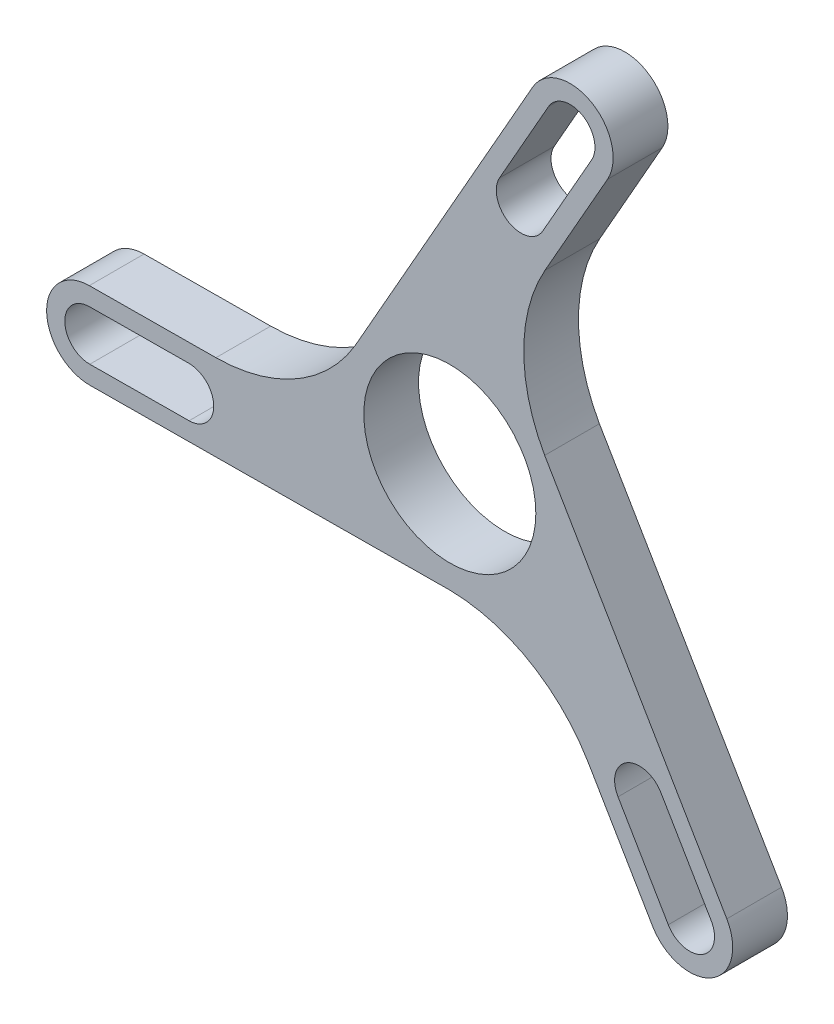
ISO-10303-21;
HEADER;
FILE_DESCRIPTION(('STEP AP214'),'2;1');
FILE_NAME('part.step','',(''),(''),'','','');
FILE_SCHEMA(('AUTOMOTIVE_DESIGN { 1 0 10303 214 1 1 1 1 }'));
ENDSEC;
DATA;
#1=APPLICATION_CONTEXT('core data for automotive mechanical design processes');
#2=APPLICATION_PROTOCOL_DEFINITION('international standard','automotive_design',2000,#1);
#3=PRODUCT_CONTEXT('',#1,'mechanical');
#4=PRODUCT('Part','Part','',(#3));
#5=PRODUCT_RELATED_PRODUCT_CATEGORY('part','',(#4));
#6=PRODUCT_DEFINITION_FORMATION('','',#4);
#7=PRODUCT_DEFINITION_CONTEXT('part definition',#1,'design');
#8=PRODUCT_DEFINITION('design','',#6,#7);
#9=PRODUCT_DEFINITION_SHAPE('','',#8);
#10=(LENGTH_UNIT() NAMED_UNIT(*) SI_UNIT(.MILLI.,.METRE.));
#11=(NAMED_UNIT(*) PLANE_ANGLE_UNIT() SI_UNIT($,.RADIAN.));
#12=(NAMED_UNIT(*) SI_UNIT($,.STERADIAN.) SOLID_ANGLE_UNIT());
#13=UNCERTAINTY_MEASURE_WITH_UNIT(LENGTH_MEASURE(1.E-05),#10,'distance_accuracy_value','');
#14=(GEOMETRIC_REPRESENTATION_CONTEXT(3) GLOBAL_UNCERTAINTY_ASSIGNED_CONTEXT((#13)) GLOBAL_UNIT_ASSIGNED_CONTEXT((#10,
#11,#12)) REPRESENTATION_CONTEXT('',''));
#15=CARTESIAN_POINT('',(0.,0.,0.));
#16=DIRECTION('',(0.,0.,1.));
#17=DIRECTION('',(1.,0.,0.));
#18=AXIS2_PLACEMENT_3D('',#15,#16,#17);
#19=CARTESIAN_POINT('',(-33.363139926865,-8.73696589252402,7.));
#20=DIRECTION('',(0.,0.,-1.));
#21=DIRECTION('',(-1.,0.,0.));
#22=AXIS2_PLACEMENT_3D('',#19,#20,#21);
#23=CYLINDRICAL_SURFACE('',#22,3.175);
#24=CARTESIAN_POINT('',(-33.363139926865,-8.73696589252402,0.));
#25=DIRECTION('',(0.,0.,1.));
#26=DIRECTION('',(1.,0.,0.));
#27=AXIS2_PLACEMENT_3D('',#24,#25,#26);
#28=CIRCLE('',#27,3.175);
#29=CARTESIAN_POINT('',(-33.340610024119,-11.9118859550582,0.));
#30=VERTEX_POINT('',#29);
#31=CARTESIAN_POINT('',(-33.3856698296109,-5.56204582998978,0.));
#32=VERTEX_POINT('',#31);
#33=EDGE_CURVE('E299',#30,#32,#28,.T.);
#34=ORIENTED_EDGE('',*,*,#33,.F.);
#35=DIRECTION('',(0.,0.,-1.));
#36=VECTOR('',#35,1.);
#37=CARTESIAN_POINT('',(-33.340610024119,-11.9118859550582,7.));
#38=LINE('',#37,#36);
#39=CARTESIAN_POINT('',(-33.340610024119,-11.9118859550582,7.));
#40=VERTEX_POINT('',#39);
#41=EDGE_CURVE('E11',#40,#30,#38,.T.);
#42=ORIENTED_EDGE('',*,*,#41,.F.);
#43=CARTESIAN_POINT('',(-33.363139926865,-8.73696589252402,7.));
#44=DIRECTION('',(0.,0.,1.));
#45=DIRECTION('',(1.,0.,0.));
#46=AXIS2_PLACEMENT_3D('',#43,#44,#45);
#47=CIRCLE('',#46,3.175);
#48=CARTESIAN_POINT('',(-33.3856698296109,-5.56204582998978,7.));
#49=VERTEX_POINT('',#48);
#50=EDGE_CURVE('E221',#40,#49,#47,.T.);
#51=ORIENTED_EDGE('',*,*,#50,.T.);
#52=DIRECTION('',(0.,0.,-1.));
#53=VECTOR('',#52,1.);
#54=CARTESIAN_POINT('',(-33.3856698296109,-5.56204582998978,7.));
#55=LINE('',#54,#53);
#56=EDGE_CURVE('E56',#49,#32,#55,.T.);
#57=ORIENTED_EDGE('',*,*,#56,.T.);
#58=EDGE_LOOP('',(#34,#42,#51,#57));
#59=FACE_BOUND('',#58,.T.);
#60=ADVANCED_FACE('F35',(#59),#23,.F.);
#61=CARTESIAN_POINT('',(0.0828461778138406,-11.6747060567203,7.));
#62=DIRECTION('',(-0.00709603236092856,0.999974822845422,0.));
#63=DIRECTION('',(-0.999974822845422,-0.00709603236092856,0.));
#64=AXIS2_PLACEMENT_3D('',#61,#62,#63);
#65=PLANE('',#64);
#66=DIRECTION('',(0.999974822845422,0.00709603236092856,0.));
#67=VECTOR('',#66,1.);
#68=CARTESIAN_POINT('',(0.0828461778138406,-11.6747060567203,0.));
#69=LINE('',#68,#67);
#70=CARTESIAN_POINT('',(-46.0402902742559,-12.002005566042,0.));
#71=VERTEX_POINT('',#70);
#72=EDGE_CURVE('E210',#71,#30,#69,.T.);
#73=ORIENTED_EDGE('',*,*,#72,.F.);
#74=DIRECTION('',(0.,0.,-1.));
#75=VECTOR('',#74,1.);
#76=CARTESIAN_POINT('',(-46.0402902742559,-12.002005566042,7.));
#77=LINE('',#76,#75);
#78=CARTESIAN_POINT('',(-46.0402902742559,-12.002005566042,7.));
#79=VERTEX_POINT('',#78);
#80=EDGE_CURVE('E47',#79,#71,#77,.T.);
#81=ORIENTED_EDGE('',*,*,#80,.F.);
#82=DIRECTION('',(0.999974822845422,0.00709603236092856,0.));
#83=VECTOR('',#82,1.);
#84=CARTESIAN_POINT('',(0.0828461778138406,-11.6747060567203,7.));
#85=LINE('',#84,#83);
#86=EDGE_CURVE('E208',#79,#40,#85,.T.);
#87=ORIENTED_EDGE('',*,*,#86,.T.);
#88=ORIENTED_EDGE('',*,*,#41,.T.);
#89=EDGE_LOOP('',(#73,#81,#87,#88));
#90=FACE_BOUND('',#89,.T.);
#91=ADVANCED_FACE('F207',(#90),#65,.T.);
#92=CARTESIAN_POINT('',(-46.0628201770018,-8.8270855035078,7.));
#93=DIRECTION('',(0.,0.,-1.));
#94=DIRECTION('',(-1.,0.,0.));
#95=AXIS2_PLACEMENT_3D('',#92,#93,#94);
#96=CYLINDRICAL_SURFACE('',#95,3.175);
#97=CARTESIAN_POINT('',(-46.0628201770018,-8.8270855035078,0.));
#98=DIRECTION('',(0.,0.,1.));
#99=DIRECTION('',(1.,0.,0.));
#100=AXIS2_PLACEMENT_3D('',#97,#98,#99);
#101=CIRCLE('',#100,3.175);
#102=CARTESIAN_POINT('',(-46.0853500797478,-5.65216544097357,0.));
#103=VERTEX_POINT('',#102);
#104=EDGE_CURVE('E302',#103,#71,#101,.T.);
#105=ORIENTED_EDGE('',*,*,#104,.F.);
#106=DIRECTION('',(0.,0.,-1.));
#107=VECTOR('',#106,1.);
#108=CARTESIAN_POINT('',(-46.0853500797478,-5.65216544097357,7.));
#109=LINE('',#108,#107);
#110=CARTESIAN_POINT('',(-46.0853500797478,-5.65216544097357,7.));
#111=VERTEX_POINT('',#110);
#112=EDGE_CURVE('E129',#111,#103,#109,.T.);
#113=ORIENTED_EDGE('',*,*,#112,.F.);
#114=CARTESIAN_POINT('',(-46.0628201770018,-8.8270855035078,7.));
#115=DIRECTION('',(0.,0.,1.));
#116=DIRECTION('',(1.,0.,0.));
#117=AXIS2_PLACEMENT_3D('',#114,#115,#116);
#118=CIRCLE('',#117,3.175);
#119=EDGE_CURVE('E220',#111,#79,#118,.T.);
#120=ORIENTED_EDGE('',*,*,#119,.T.);
#121=ORIENTED_EDGE('',*,*,#80,.T.);
#122=EDGE_LOOP('',(#105,#113,#120,#121));
#123=FACE_BOUND('',#122,.T.);
#124=ADVANCED_FACE('F223',(#123),#96,.F.);
#125=CARTESIAN_POINT('',(24.2480043783566,-24.5248437804179,7.));
#126=DIRECTION('',(0.,0.,-1.));
#127=DIRECTION('',(-1.,0.,0.));
#128=AXIS2_PLACEMENT_3D('',#125,#126,#127);
#129=CYLINDRICAL_SURFACE('',#128,3.175);
#130=CARTESIAN_POINT('',(24.2480043783566,-24.5248437804179,0.));
#131=DIRECTION('',(0.,0.,1.));
#132=DIRECTION('',(1.,0.,0.));
#133=AXIS2_PLACEMENT_3D('',#130,#131,#132);
#134=CIRCLE('',#133,3.175);
#135=CARTESIAN_POINT('',(26.9863008561232,-22.9178722810268,0.));
#136=VERTEX_POINT('',#135);
#137=CARTESIAN_POINT('',(21.5097079005902,-26.1318152798066,0.));
#138=VERTEX_POINT('',#137);
#139=EDGE_CURVE('E287',#136,#138,#134,.T.);
#140=ORIENTED_EDGE('',*,*,#139,.F.);
#141=DIRECTION('',(0.,0.,-1.));
#142=VECTOR('',#141,1.);
#143=CARTESIAN_POINT('',(26.9863008561232,-22.9178722810268,7.));
#144=LINE('',#143,#142);
#145=CARTESIAN_POINT('',(26.9863008561232,-22.9178722810268,7.));
#146=VERTEX_POINT('',#145);
#147=EDGE_CURVE('E308',#146,#136,#144,.T.);
#148=ORIENTED_EDGE('',*,*,#147,.F.);
#149=CARTESIAN_POINT('',(24.2480043783566,-24.5248437804179,7.));
#150=DIRECTION('',(0.,0.,1.));
#151=DIRECTION('',(1.,0.,0.));
#152=AXIS2_PLACEMENT_3D('',#149,#150,#151);
#153=CIRCLE('',#152,3.175);
#154=CARTESIAN_POINT('',(21.5097079005902,-26.1318152798066,7.));
#155=VERTEX_POINT('',#154);
#156=EDGE_CURVE('E562',#146,#155,#153,.T.);
#157=ORIENTED_EDGE('',*,*,#156,.T.);
#158=DIRECTION('',(0.,0.,-1.));
#159=VECTOR('',#158,1.);
#160=CARTESIAN_POINT('',(21.5097079005902,-26.1318152798066,7.));
#161=LINE('',#160,#159);
#162=EDGE_CURVE('E310',#155,#138,#161,.T.);
#163=ORIENTED_EDGE('',*,*,#162,.T.);
#164=EDGE_LOOP('',(#140,#148,#157,#163));
#165=FACE_BOUND('',#164,.T.);
#166=ADVANCED_FACE('F465',(#165),#129,.F.);
#167=CARTESIAN_POINT('',(10.0691689379293,5.90909992295373,7.));
#168=DIRECTION('',(-0.86245558354851,-0.506132755713359,0.));
#169=DIRECTION('',(0.506132755713359,-0.86245558354851,0.));
#170=AXIS2_PLACEMENT_3D('',#167,#168,#169);
#171=PLANE('',#170);
#172=DIRECTION('',(-0.506132755713359,0.86245558354851,0.));
#173=VECTOR('',#172,1.);
#174=CARTESIAN_POINT('',(10.0691689379293,5.90909992295373,0.));
#175=LINE('',#174,#173);
#176=CARTESIAN_POINT('',(33.4141868536829,-33.8710581920929,0.));
#177=VERTEX_POINT('',#176);
#178=EDGE_CURVE('E290',#177,#136,#175,.T.);
#179=ORIENTED_EDGE('',*,*,#178,.F.);
#180=DIRECTION('',(0.,0.,-1.));
#181=VECTOR('',#180,1.);
#182=CARTESIAN_POINT('',(33.4141868536829,-33.8710581920929,7.));
#183=LINE('',#182,#181);
#184=CARTESIAN_POINT('',(33.4141868536829,-33.8710581920929,7.));
#185=VERTEX_POINT('',#184);
#186=EDGE_CURVE('E315',#185,#177,#183,.T.);
#187=ORIENTED_EDGE('',*,*,#186,.F.);
#188=DIRECTION('',(-0.506132755713359,0.86245558354851,0.));
#189=VECTOR('',#188,1.);
#190=CARTESIAN_POINT('',(10.0691689379293,5.90909992295373,7.));
#191=LINE('',#190,#189);
#192=EDGE_CURVE('E565',#185,#146,#191,.T.);
#193=ORIENTED_EDGE('',*,*,#192,.T.);
#194=ORIENTED_EDGE('',*,*,#147,.T.);
#195=EDGE_LOOP('',(#179,#187,#193,#194));
#196=FACE_BOUND('',#195,.T.);
#197=ADVANCED_FACE('F461',(#196),#171,.T.);
#198=CARTESIAN_POINT('',(30.6758903759164,-35.4780296914828,7.));
#199=DIRECTION('',(0.,0.,-1.));
#200=DIRECTION('',(-1.,0.,0.));
#201=AXIS2_PLACEMENT_3D('',#198,#199,#200);
#202=CYLINDRICAL_SURFACE('',#201,3.175);
#203=CARTESIAN_POINT('',(30.6758903759164,-35.4780296914828,0.));
#204=DIRECTION('',(0.,0.,1.));
#205=DIRECTION('',(1.,0.,0.));
#206=AXIS2_PLACEMENT_3D('',#203,#204,#205);
#207=CIRCLE('',#206,3.175);
#208=CARTESIAN_POINT('',(27.9375938981498,-37.0850011908727,0.));
#209=VERTEX_POINT('',#208);
#210=EDGE_CURVE('E293',#209,#177,#207,.T.);
#211=ORIENTED_EDGE('',*,*,#210,.F.);
#212=DIRECTION('',(0.,0.,-1.));
#213=VECTOR('',#212,1.);
#214=CARTESIAN_POINT('',(27.9375938981498,-37.0850011908727,7.));
#215=LINE('',#214,#213);
#216=CARTESIAN_POINT('',(27.9375938981498,-37.0850011908727,7.));
#217=VERTEX_POINT('',#216);
#218=EDGE_CURVE('E312',#217,#209,#215,.T.);
#219=ORIENTED_EDGE('',*,*,#218,.F.);
#220=CARTESIAN_POINT('',(30.6758903759164,-35.4780296914828,7.));
#221=DIRECTION('',(0.,0.,1.));
#222=DIRECTION('',(1.,0.,0.));
#223=AXIS2_PLACEMENT_3D('',#220,#221,#222);
#224=CIRCLE('',#223,3.175);
#225=EDGE_CURVE('E568',#217,#185,#224,.T.);
#226=ORIENTED_EDGE('',*,*,#225,.T.);
#227=ORIENTED_EDGE('',*,*,#186,.T.);
#228=EDGE_LOOP('',(#211,#219,#226,#227));
#229=FACE_BOUND('',#228,.T.);
#230=ADVANCED_FACE('F457',(#229),#202,.F.);
#231=CARTESIAN_POINT('',(9.1151355485082,33.2618096729421,7.));
#232=DIRECTION('',(0.,0.,-1.));
#233=DIRECTION('',(-1.,0.,0.));
#234=AXIS2_PLACEMENT_3D('',#231,#232,#233);
#235=CYLINDRICAL_SURFACE('',#234,3.175);
#236=CARTESIAN_POINT('',(9.1151355485082,33.2618096729421,0.));
#237=DIRECTION('',(0.,0.,1.));
#238=DIRECTION('',(1.,0.,0.));
#239=AXIS2_PLACEMENT_3D('',#236,#237,#238);
#240=CIRCLE('',#239,3.175);
#241=CARTESIAN_POINT('',(6.35430916799572,34.8297582360864,0.));
#242=VERTEX_POINT('',#241);
#243=CARTESIAN_POINT('',(11.8759619290207,31.6938611097978,0.));
#244=VERTEX_POINT('',#243);
#245=EDGE_CURVE('E272',#242,#244,#240,.T.);
#246=ORIENTED_EDGE('',*,*,#245,.F.);
#247=DIRECTION('',(0.,0.,-1.));
#248=VECTOR('',#247,1.);
#249=CARTESIAN_POINT('',(6.35430916799572,34.8297582360864,7.));
#250=LINE('',#249,#248);
#251=CARTESIAN_POINT('',(6.35430916799572,34.8297582360864,7.));
#252=VERTEX_POINT('',#251);
#253=EDGE_CURVE('E313',#252,#242,#250,.T.);
#254=ORIENTED_EDGE('',*,*,#253,.F.);
#255=CARTESIAN_POINT('',(9.1151355485082,33.2618096729421,7.));
#256=DIRECTION('',(0.,0.,1.));
#257=DIRECTION('',(1.,0.,0.));
#258=AXIS2_PLACEMENT_3D('',#255,#256,#257);
#259=CIRCLE('',#258,3.175);
#260=CARTESIAN_POINT('',(11.8759619290207,31.6938611097978,7.));
#261=VERTEX_POINT('',#260);
#262=EDGE_CURVE('E547',#252,#261,#259,.T.);
#263=ORIENTED_EDGE('',*,*,#262,.T.);
#264=DIRECTION('',(0.,0.,-1.));
#265=VECTOR('',#264,1.);
#266=CARTESIAN_POINT('',(11.8759619290207,31.6938611097978,7.));
#267=LINE('',#266,#265);
#268=EDGE_CURVE('E318',#261,#244,#267,.T.);
#269=ORIENTED_EDGE('',*,*,#268,.T.);
#270=EDGE_LOOP('',(#246,#254,#263,#269));
#271=FACE_BOUND('',#270,.T.);
#272=ADVANCED_FACE('F460',(#271),#235,.F.);
#273=CARTESIAN_POINT('',(-10.1520151157428,5.76560613376681,7.));
#274=DIRECTION('',(0.869551615909448,-0.493842067132062,0.));
#275=DIRECTION('',(0.493842067132062,0.869551615909448,0.));
#276=AXIS2_PLACEMENT_3D('',#273,#274,#275);
#277=PLANE('',#276);
#278=DIRECTION('',(-0.493842067132062,-0.869551615909448,0.));
#279=VECTOR('',#278,1.);
#280=CARTESIAN_POINT('',(-10.1520151157428,5.76560613376681,0.));
#281=LINE('',#280,#279);
#282=CARTESIAN_POINT('',(12.6261034205729,45.8730637581364,0.));
#283=VERTEX_POINT('',#282);
#284=EDGE_CURVE('E275',#283,#242,#281,.T.);
#285=ORIENTED_EDGE('',*,*,#284,.F.);
#286=DIRECTION('',(0.,0.,-1.));
#287=VECTOR('',#286,1.);
#288=CARTESIAN_POINT('',(12.6261034205729,45.8730637581364,7.));
#289=LINE('',#288,#287);
#290=CARTESIAN_POINT('',(12.6261034205729,45.8730637581364,7.));
#291=VERTEX_POINT('',#290);
#292=EDGE_CURVE('E323',#291,#283,#289,.T.);
#293=ORIENTED_EDGE('',*,*,#292,.F.);
#294=DIRECTION('',(-0.493842067132062,-0.869551615909448,0.));
#295=VECTOR('',#294,1.);
#296=CARTESIAN_POINT('',(-10.1520151157428,5.76560613376681,7.));
#297=LINE('',#296,#295);
#298=EDGE_CURVE('E550',#291,#252,#297,.T.);
#299=ORIENTED_EDGE('',*,*,#298,.T.);
#300=ORIENTED_EDGE('',*,*,#253,.T.);
#301=EDGE_LOOP('',(#285,#293,#299,#300));
#302=FACE_BOUND('',#301,.T.);
#303=ADVANCED_FACE('F481',(#302),#277,.T.);
#304=CARTESIAN_POINT('',(15.3869298010854,44.305115194992,7.));
#305=DIRECTION('',(0.,0.,-1.));
#306=DIRECTION('',(-1.,0.,0.));
#307=AXIS2_PLACEMENT_3D('',#304,#305,#306);
#308=CYLINDRICAL_SURFACE('',#307,3.175);
#309=CARTESIAN_POINT('',(15.3869298010854,44.305115194992,0.));
#310=DIRECTION('',(0.,0.,1.));
#311=DIRECTION('',(1.,0.,0.));
#312=AXIS2_PLACEMENT_3D('',#309,#310,#311);
#313=CIRCLE('',#312,3.175);
#314=CARTESIAN_POINT('',(18.1477561815979,42.7371666318477,0.));
#315=VERTEX_POINT('',#314);
#316=EDGE_CURVE('E278',#315,#283,#313,.T.);
#317=ORIENTED_EDGE('',*,*,#316,.F.);
#318=DIRECTION('',(0.,0.,-1.));
#319=VECTOR('',#318,1.);
#320=CARTESIAN_POINT('',(18.1477561815979,42.7371666318477,7.));
#321=LINE('',#320,#319);
#322=CARTESIAN_POINT('',(18.1477561815979,42.7371666318477,7.));
#323=VERTEX_POINT('',#322);
#324=EDGE_CURVE('E320',#323,#315,#321,.T.);
#325=ORIENTED_EDGE('',*,*,#324,.F.);
#326=CARTESIAN_POINT('',(15.3869298010854,44.305115194992,7.));
#327=DIRECTION('',(0.,0.,1.));
#328=DIRECTION('',(1.,0.,0.));
#329=AXIS2_PLACEMENT_3D('',#326,#327,#328);
#330=CIRCLE('',#329,3.175);
#331=EDGE_CURVE('E553',#323,#291,#330,.T.);
#332=ORIENTED_EDGE('',*,*,#331,.T.);
#333=ORIENTED_EDGE('',*,*,#292,.T.);
#334=EDGE_LOOP('',(#317,#325,#332,#333));
#335=FACE_BOUND('',#334,.T.);
#336=ADVANCED_FACE('F478',(#335),#308,.F.);
#337=CARTESIAN_POINT('',(-12.1737226227323,6.91378893984889,7.));
#338=DIRECTION('',(0.869551615909447,-0.493842067132063,0.));
#339=DIRECTION('',(0.493842067132063,0.869551615909447,0.));
#340=AXIS2_PLACEMENT_3D('',#337,#338,#339);
#341=PLANE('',#340);
#342=DIRECTION('',(-0.493842067132063,-0.869551615909447,0.));
#343=VECTOR('',#342,1.);
#344=CARTESIAN_POINT('',(-12.1737226227323,6.91378893984889,0.));
#345=LINE('',#344,#343);
#346=CARTESIAN_POINT('',(10.6043959135834,47.0212465642184,0.));
#347=VERTEX_POINT('',#346);
#348=CARTESIAN_POINT('',(-12.1186859855352,7.0102508577412,0.));
#349=VERTEX_POINT('',#348);
#350=EDGE_CURVE('E230',#347,#349,#345,.T.);
#351=ORIENTED_EDGE('',*,*,#350,.T.);
#352=CARTESIAN_POINT('',(-12.1188754884742,7.01036308831298,7.));
#353=DIRECTION('',(0.,0.,-1.));
#354=VECTOR('',#353,1.);
#355=LINE('',#352,#354);
#356=CARTESIAN_POINT('',(-12.1186859855352,7.0102508577412,7.));
#357=VERTEX_POINT('',#356);
#358=EDGE_CURVE('E321',#357,#349,#355,.T.);
#359=ORIENTED_EDGE('',*,*,#358,.F.);
#360=DIRECTION('',(-0.493842067132063,-0.869551615909447,0.));
#361=VECTOR('',#360,1.);
#362=CARTESIAN_POINT('',(-12.1737226227323,6.91378893984889,7.));
#363=LINE('',#362,#361);
#364=CARTESIAN_POINT('',(10.6043959135834,47.0212465642184,7.));
#365=VERTEX_POINT('',#364);
#366=EDGE_CURVE('E142',#365,#357,#363,.T.);
#367=ORIENTED_EDGE('',*,*,#366,.F.);
#368=DIRECTION('',(0.,0.,-1.));
#369=VECTOR('',#368,1.);
#370=CARTESIAN_POINT('',(10.6043959135834,47.0212465642184,7.));
#371=LINE('',#370,#369);
#372=EDGE_CURVE('E226',#365,#347,#371,.T.);
#373=ORIENTED_EDGE('',*,*,#372,.T.);
#374=EDGE_LOOP('',(#351,#359,#367,#373));
#375=FACE_BOUND('',#374,.T.);
#376=ADVANCED_FACE('F37',(#375),#341,.F.);
#377=CARTESIAN_POINT('',(-30.0549696222701,17.6327740677028,7.));
#378=DIRECTION('',(0.,0.,-1.));
#379=DIRECTION('',(-1.,0.,0.));
#380=AXIS2_PLACEMENT_3D('',#377,#378,#379);
#381=CYLINDRICAL_SURFACE('',#380,20.8456011616708);
#382=CARTESIAN_POINT('',(-30.0549696222701,17.6327740677028,0.));
#383=DIRECTION('',(0.,0.,1.));
#384=DIRECTION('',(1.,0.,0.));
#385=AXIS2_PLACEMENT_3D('',#382,#383,#384);
#386=CIRCLE('',#385,20.8456011616708);
#387=CARTESIAN_POINT('',(-29.9070485618439,-3.21230226104525,0.));
#388=VERTEX_POINT('',#387);
#389=EDGE_CURVE('E233',#388,#349,#386,.T.);
#390=ORIENTED_EDGE('',*,*,#389,.F.);
#391=DIRECTION('',(0.,0.,-1.));
#392=VECTOR('',#391,1.);
#393=CARTESIAN_POINT('',(-29.9070485618439,-3.21230226104525,7.));
#394=LINE('',#393,#392);
#395=CARTESIAN_POINT('',(-29.9070485618439,-3.21230226104525,7.));
#396=VERTEX_POINT('',#395);
#397=EDGE_CURVE('E349',#396,#388,#394,.T.);
#398=ORIENTED_EDGE('',*,*,#397,.F.);
#399=CARTESIAN_POINT('',(-30.0549696222701,17.6327740677028,7.));
#400=DIRECTION('',(0.,0.,1.));
#401=DIRECTION('',(1.,0.,0.));
#402=AXIS2_PLACEMENT_3D('',#399,#400,#401);
#403=CIRCLE('',#402,20.8456011616708);
#404=EDGE_CURVE('E508',#396,#357,#403,.T.);
#405=ORIENTED_EDGE('',*,*,#404,.T.);
#406=ORIENTED_EDGE('',*,*,#358,.T.);
#407=EDGE_LOOP('',(#390,#398,#405,#406));
#408=FACE_BOUND('',#407,.T.);
#409=ADVANCED_FACE('F429',(#408),#381,.F.);
#410=CARTESIAN_POINT('',(0.0212880970827849,-2.99992446853623,7.));
#411=DIRECTION('',(0.00709603236092838,-0.999974822845422,0.));
#412=DIRECTION('',(0.999974822845422,0.00709603236092838,0.));
#413=AXIS2_PLACEMENT_3D('',#410,#411,#412);
#414=PLANE('',#413);
#415=DIRECTION('',(-0.999974822845422,-0.00709603236092838,0.));
#416=VECTOR('',#415,1.);
#417=CARTESIAN_POINT('',(0.0212880970827849,-2.99992446853623,0.));
#418=LINE('',#417,#416);
#419=CARTESIAN_POINT('',(-46.1018483549869,-3.32722397785798,0.));
#420=VERTEX_POINT('',#419);
#421=EDGE_CURVE('E238',#388,#420,#418,.T.);
#422=ORIENTED_EDGE('',*,*,#421,.T.);
#423=DIRECTION('',(0.,0.,-1.));
#424=VECTOR('',#423,1.);
#425=CARTESIAN_POINT('',(-46.1018483549869,-3.32722397785798,7.));
#426=LINE('',#425,#424);
#427=CARTESIAN_POINT('',(-46.1018483549869,-3.32722397785798,7.));
#428=VERTEX_POINT('',#427);
#429=EDGE_CURVE('E346',#428,#420,#426,.T.);
#430=ORIENTED_EDGE('',*,*,#429,.F.);
#431=DIRECTION('',(-0.999974822845422,-0.00709603236092838,0.));
#432=VECTOR('',#431,1.);
#433=CARTESIAN_POINT('',(0.0212880970827849,-2.99992446853623,7.));
#434=LINE('',#433,#432);
#435=EDGE_CURVE('E510',#396,#428,#434,.T.);
#436=ORIENTED_EDGE('',*,*,#435,.F.);
#437=ORIENTED_EDGE('',*,*,#397,.T.);
#438=EDGE_LOOP('',(#422,#430,#436,#437));
#439=FACE_BOUND('',#438,.T.);
#440=ADVANCED_FACE('F437',(#439),#414,.F.);
#441=CARTESIAN_POINT('',(-46.0628201770018,-8.8270855035078,7.));
#442=DIRECTION('',(0.,0.,-1.));
#443=DIRECTION('',(-1.,0.,0.));
#444=AXIS2_PLACEMENT_3D('',#441,#442,#443);
#445=CYLINDRICAL_SURFACE('',#444,5.5);
#446=CARTESIAN_POINT('',(-46.0628201770018,-8.8270855035078,0.));
#447=DIRECTION('',(0.,0.,1.));
#448=DIRECTION('',(1.,0.,0.));
#449=AXIS2_PLACEMENT_3D('',#446,#447,#448);
#450=CIRCLE('',#449,5.5);
#451=CARTESIAN_POINT('',(-46.0237919990167,-14.3269470291576,0.));
#452=VERTEX_POINT('',#451);
#453=EDGE_CURVE('E242',#420,#452,#450,.T.);
#454=ORIENTED_EDGE('',*,*,#453,.T.);
#455=DIRECTION('',(0.,0.,-1.));
#456=VECTOR('',#455,1.);
#457=CARTESIAN_POINT('',(-46.0237919990167,-14.3269470291576,7.));
#458=LINE('',#457,#456);
#459=CARTESIAN_POINT('',(-46.0237919990167,-14.3269470291576,7.));
#460=VERTEX_POINT('',#459);
#461=EDGE_CURVE('E343',#460,#452,#458,.T.);
#462=ORIENTED_EDGE('',*,*,#461,.F.);
#463=CARTESIAN_POINT('',(-46.0628201770018,-8.8270855035078,7.));
#464=DIRECTION('',(0.,0.,1.));
#465=DIRECTION('',(1.,0.,0.));
#466=AXIS2_PLACEMENT_3D('',#463,#464,#465);
#467=CIRCLE('',#466,5.5);
#468=EDGE_CURVE('E512',#428,#460,#467,.T.);
#469=ORIENTED_EDGE('',*,*,#468,.F.);
#470=ORIENTED_EDGE('',*,*,#429,.T.);
#471=EDGE_LOOP('',(#454,#462,#469,#470));
#472=FACE_BOUND('',#471,.T.);
#473=ADVANCED_FACE('F412',(#472),#445,.T.);
#474=CARTESIAN_POINT('',(0.0993444530529865,-13.9996475198359,7.));
#475=DIRECTION('',(-0.00709603236092761,0.999974822845422,0.));
#476=DIRECTION('',(-0.999974822845422,-0.00709603236092761,0.));
#477=AXIS2_PLACEMENT_3D('',#474,#475,#476);
#478=PLANE('',#477);
#479=DIRECTION('',(0.999974822845422,0.00709603236092761,0.));
#480=VECTOR('',#479,1.);
#481=CARTESIAN_POINT('',(0.0993444530529865,-13.9996475198359,0.));
#482=LINE('',#481,#480);
#483=CARTESIAN_POINT('',(-0.0117121185464996,-14.0002153503063,0.));
#484=VERTEX_POINT('',#483);
#485=EDGE_CURVE('E244',#452,#484,#482,.T.);
#486=ORIENTED_EDGE('',*,*,#485,.T.);
#487=CARTESIAN_POINT('',(-0.0117145616604085,-14.0004355848977,7.));
#488=DIRECTION('',(0.,0.,-1.));
#489=VECTOR('',#488,1.);
#490=LINE('',#487,#489);
#491=CARTESIAN_POINT('',(-0.0117121185464996,-14.0002153503063,7.));
#492=VERTEX_POINT('',#491);
#493=EDGE_CURVE('E342',#492,#484,#490,.T.);
#494=ORIENTED_EDGE('',*,*,#493,.F.);
#495=DIRECTION('',(0.999974822845422,0.00709603236092761,0.));
#496=VECTOR('',#495,1.);
#497=CARTESIAN_POINT('',(0.0993444530529865,-13.9996475198359,7.));
#498=LINE('',#497,#496);
#499=EDGE_CURVE('E523',#460,#492,#498,.T.);
#500=ORIENTED_EDGE('',*,*,#499,.F.);
#501=ORIENTED_EDGE('',*,*,#461,.T.);
#502=EDGE_LOOP('',(#486,#494,#500,#501));
#503=FACE_BOUND('',#502,.T.);
#504=ADVANCED_FACE('F408',(#503),#478,.F.);
#505=CARTESIAN_POINT('',(-0.242945470686883,-34.8447542367069,7.));
#506=DIRECTION('',(0.,0.,-1.));
#507=DIRECTION('',(-1.,0.,0.));
#508=AXIS2_PLACEMENT_3D('',#505,#506,#507);
#509=CYLINDRICAL_SURFACE('',#508,20.8456011616708);
#510=CARTESIAN_POINT('',(-0.242945470686883,-34.8447542367069,0.));
#511=DIRECTION('',(0.,0.,1.));
#512=DIRECTION('',(1.,0.,0.));
#513=AXIS2_PLACEMENT_3D('',#510,#511,#512);
#514=CIRCLE('',#513,20.8456011616708);
#515=CARTESIAN_POINT('',(17.7354596436214,-24.294112676249,0.));
#516=VERTEX_POINT('',#515);
#517=EDGE_CURVE('E247',#516,#484,#514,.T.);
#518=ORIENTED_EDGE('',*,*,#517,.F.);
#519=DIRECTION('',(0.,0.,-1.));
#520=VECTOR('',#519,1.);
#521=CARTESIAN_POINT('',(17.7354596436214,-24.294112676249,7.));
#522=LINE('',#521,#520);
#523=CARTESIAN_POINT('',(17.7354596436214,-24.294112676249,7.));
#524=VERTEX_POINT('',#523);
#525=EDGE_CURVE('E340',#524,#516,#522,.T.);
#526=ORIENTED_EDGE('',*,*,#525,.F.);
#527=CARTESIAN_POINT('',(-0.242945470686883,-34.8447542367069,7.));
#528=DIRECTION('',(0.,0.,1.));
#529=DIRECTION('',(1.,0.,0.));
#530=AXIS2_PLACEMENT_3D('',#527,#528,#529);
#531=CIRCLE('',#530,20.8456011616708);
#532=EDGE_CURVE('E525',#524,#492,#531,.T.);
#533=ORIENTED_EDGE('',*,*,#532,.T.);
#534=ORIENTED_EDGE('',*,*,#493,.T.);
#535=EDGE_LOOP('',(#518,#526,#533,#534));
#536=FACE_BOUND('',#535,.T.);
#537=ADVANCED_FACE('F398',(#536),#509,.F.);
#538=CARTESIAN_POINT('',(2.58736675064424,1.51839826713947,7.));
#539=DIRECTION('',(0.862455583548489,0.506132755713396,0.));
#540=DIRECTION('',(-0.506132755713396,0.862455583548489,0.));
#541=AXIS2_PLACEMENT_3D('',#538,#539,#540);
#542=PLANE('',#541);
#543=DIRECTION('',(0.506132755713396,-0.862455583548489,0.));
#544=VECTOR('',#543,1.);
#545=CARTESIAN_POINT('',(2.58736675064424,1.51839826713947,0.));
#546=LINE('',#545,#544);
#547=CARTESIAN_POINT('',(25.9323846663996,-38.2617598479063,0.));
#548=VERTEX_POINT('',#547);
#549=EDGE_CURVE('E252',#516,#548,#546,.T.);
#550=ORIENTED_EDGE('',*,*,#549,.T.);
#551=DIRECTION('',(0.,0.,-1.));
#552=VECTOR('',#551,1.);
#553=CARTESIAN_POINT('',(25.9323846663996,-38.2617598479063,7.));
#554=LINE('',#553,#552);
#555=CARTESIAN_POINT('',(25.9323846663996,-38.2617598479063,7.));
#556=VERTEX_POINT('',#555);
#557=EDGE_CURVE('E337',#556,#548,#554,.T.);
#558=ORIENTED_EDGE('',*,*,#557,.F.);
#559=DIRECTION('',(0.506132755713396,-0.862455583548489,0.));
#560=VECTOR('',#559,1.);
#561=CARTESIAN_POINT('',(2.58736675064424,1.51839826713947,7.));
#562=LINE('',#561,#560);
#563=EDGE_CURVE('E529',#524,#556,#562,.T.);
#564=ORIENTED_EDGE('',*,*,#563,.F.);
#565=ORIENTED_EDGE('',*,*,#525,.T.);
#566=EDGE_LOOP('',(#550,#558,#564,#565));
#567=FACE_BOUND('',#566,.T.);
#568=ADVANCED_FACE('F407',(#567),#542,.F.);
#569=CARTESIAN_POINT('',(30.6758903759164,-35.4780296914828,7.));
#570=DIRECTION('',(0.,0.,-1.));
#571=DIRECTION('',(-1.,0.,0.));
#572=AXIS2_PLACEMENT_3D('',#569,#570,#571);
#573=CYLINDRICAL_SURFACE('',#572,5.49999999999999);
#574=CARTESIAN_POINT('',(30.6758903759164,-35.4780296914828,0.));
#575=DIRECTION('',(0.,0.,1.));
#576=DIRECTION('',(1.,0.,0.));
#577=AXIS2_PLACEMENT_3D('',#574,#575,#576);
#578=CIRCLE('',#577,5.49999999999999);
#579=CARTESIAN_POINT('',(35.4193960854332,-32.6942995350593,0.));
#580=VERTEX_POINT('',#579);
#581=EDGE_CURVE('E256',#548,#580,#578,.T.);
#582=ORIENTED_EDGE('',*,*,#581,.T.);
#583=DIRECTION('',(0.,0.,-1.));
#584=VECTOR('',#583,1.);
#585=CARTESIAN_POINT('',(35.4193960854332,-32.6942995350593,7.));
#586=LINE('',#585,#584);
#587=CARTESIAN_POINT('',(35.4193960854332,-32.6942995350593,7.));
#588=VERTEX_POINT('',#587);
#589=EDGE_CURVE('E334',#588,#580,#586,.T.);
#590=ORIENTED_EDGE('',*,*,#589,.F.);
#591=CARTESIAN_POINT('',(30.6758903759164,-35.4780296914828,7.));
#592=DIRECTION('',(0.,0.,1.));
#593=DIRECTION('',(1.,0.,0.));
#594=AXIS2_PLACEMENT_3D('',#591,#592,#593);
#595=CIRCLE('',#594,5.49999999999999);
#596=EDGE_CURVE('E533',#556,#588,#595,.T.);
#597=ORIENTED_EDGE('',*,*,#596,.F.);
#598=ORIENTED_EDGE('',*,*,#557,.T.);
#599=EDGE_LOOP('',(#582,#590,#597,#598));
#600=FACE_BOUND('',#599,.T.);
#601=ADVANCED_FACE('F377',(#600),#573,.T.);
#602=CARTESIAN_POINT('',(12.0743781696791,7.08585857998716,7.));
#603=DIRECTION('',(-0.862455583548504,-0.506132755713369,0.));
#604=DIRECTION('',(0.506132755713369,-0.862455583548504,0.));
#605=AXIS2_PLACEMENT_3D('',#602,#603,#604);
#606=PLANE('',#605);
#607=DIRECTION('',(-0.506132755713369,0.862455583548504,0.));
#608=VECTOR('',#607,1.);
#609=CARTESIAN_POINT('',(12.0743781696791,7.08585857998716,0.));
#610=LINE('',#609,#608);
#611=CARTESIAN_POINT('',(12.1303983551163,6.98996444008555,0.));
#612=VERTEX_POINT('',#611);
#613=EDGE_CURVE('E258',#580,#612,#610,.T.);
#614=ORIENTED_EDGE('',*,*,#613,.T.);
#615=CARTESIAN_POINT('',(12.1305902998242,6.9900724384351,7.));
#616=DIRECTION('',(0.,0.,-1.));
#617=VECTOR('',#616,1.);
#618=LINE('',#615,#617);
#619=CARTESIAN_POINT('',(12.1303983551163,6.98996444008555,7.));
#620=VERTEX_POINT('',#619);
#621=EDGE_CURVE('E333',#620,#612,#618,.T.);
#622=ORIENTED_EDGE('',*,*,#621,.F.);
#623=DIRECTION('',(-0.506132755713369,0.862455583548504,0.));
#624=VECTOR('',#623,1.);
#625=CARTESIAN_POINT('',(12.0743781696791,7.08585857998716,7.));
#626=LINE('',#625,#624);
#627=EDGE_CURVE('E535',#588,#620,#626,.T.);
#628=ORIENTED_EDGE('',*,*,#627,.F.);
#629=ORIENTED_EDGE('',*,*,#589,.T.);
#630=EDGE_LOOP('',(#614,#622,#628,#629));
#631=FACE_BOUND('',#630,.T.);
#632=ADVANCED_FACE('F372',(#631),#606,.F.);
#633=CARTESIAN_POINT('',(30.297915092957,17.2119801690044,7.));
#634=DIRECTION('',(0.,0.,-1.));
#635=DIRECTION('',(-1.,0.,0.));
#636=AXIS2_PLACEMENT_3D('',#633,#634,#635);
#637=CYLINDRICAL_SURFACE('',#636,20.8456011616708);
#638=CARTESIAN_POINT('',(30.297915092957,17.2119801690044,0.));
#639=DIRECTION('',(0.,0.,1.));
#640=DIRECTION('',(1.,0.,0.));
#641=AXIS2_PLACEMENT_3D('',#638,#639,#640);
#642=CIRCLE('',#641,20.8456011616708);
#643=CARTESIAN_POINT('',(12.1715889182223,27.5064149372944,0.));
#644=VERTEX_POINT('',#643);
#645=EDGE_CURVE('E261',#644,#612,#642,.T.);
#646=ORIENTED_EDGE('',*,*,#645,.F.);
#647=DIRECTION('',(0.,0.,-1.));
#648=VECTOR('',#647,1.);
#649=CARTESIAN_POINT('',(12.1715889182223,27.5064149372944,7.));
#650=LINE('',#649,#648);
#651=CARTESIAN_POINT('',(12.1715889182223,27.5064149372944,7.));
#652=VERTEX_POINT('',#651);
#653=EDGE_CURVE('E331',#652,#644,#650,.T.);
#654=ORIENTED_EDGE('',*,*,#653,.F.);
#655=CARTESIAN_POINT('',(30.297915092957,17.2119801690044,7.));
#656=DIRECTION('',(0.,0.,1.));
#657=DIRECTION('',(1.,0.,0.));
#658=AXIS2_PLACEMENT_3D('',#655,#656,#657);
#659=CIRCLE('',#658,20.8456011616708);
#660=EDGE_CURVE('E537',#652,#620,#659,.T.);
#661=ORIENTED_EDGE('',*,*,#660,.T.);
#662=ORIENTED_EDGE('',*,*,#621,.T.);
#663=EDGE_LOOP('',(#646,#654,#661,#662));
#664=FACE_BOUND('',#663,.T.);
#665=ADVANCED_FACE('F361',(#664),#637,.F.);
#666=CARTESIAN_POINT('',(-2.60865484772832,1.48152620139618,7.));
#667=DIRECTION('',(-0.869551615909448,0.493842067132063,0.));
#668=DIRECTION('',(-0.493842067132063,-0.869551615909448,0.));
#669=AXIS2_PLACEMENT_3D('',#666,#667,#668);
#670=PLANE('',#669);
#671=DIRECTION('',(0.493842067132063,0.869551615909448,0.));
#672=VECTOR('',#671,1.);
#673=CARTESIAN_POINT('',(-2.60865484772832,1.48152620139618,0.));
#674=LINE('',#673,#672);
#675=CARTESIAN_POINT('',(20.1694636885874,41.5889838257657,0.));
#676=VERTEX_POINT('',#675);
#677=EDGE_CURVE('E266',#644,#676,#674,.T.);
#678=ORIENTED_EDGE('',*,*,#677,.T.);
#679=DIRECTION('',(0.,0.,-1.));
#680=VECTOR('',#679,1.);
#681=CARTESIAN_POINT('',(20.1694636885874,41.5889838257657,7.));
#682=LINE('',#681,#680);
#683=CARTESIAN_POINT('',(20.1694636885874,41.5889838257657,7.));
#684=VERTEX_POINT('',#683);
#685=EDGE_CURVE('E328',#684,#676,#682,.T.);
#686=ORIENTED_EDGE('',*,*,#685,.F.);
#687=DIRECTION('',(0.493842067132063,0.869551615909448,0.));
#688=VECTOR('',#687,1.);
#689=CARTESIAN_POINT('',(-2.60865484772832,1.48152620139618,7.));
#690=LINE('',#689,#688);
#691=EDGE_CURVE('E541',#652,#684,#690,.T.);
#692=ORIENTED_EDGE('',*,*,#691,.F.);
#693=ORIENTED_EDGE('',*,*,#653,.T.);
#694=EDGE_LOOP('',(#678,#686,#692,#693));
#695=FACE_BOUND('',#694,.T.);
#696=ADVANCED_FACE('F371',(#695),#670,.F.);
#697=CARTESIAN_POINT('',(4.59257598239629,2.69515692417391,7.));
#698=DIRECTION('',(0.862455583548511,0.506132755713358,0.));
#699=DIRECTION('',(-0.506132755713358,0.862455583548511,0.));
#700=AXIS2_PLACEMENT_3D('',#697,#698,#699);
#701=PLANE('',#700);
#702=DIRECTION('',(0.506132755713358,-0.86245558354851,0.));
#703=VECTOR('',#702,1.);
#704=CARTESIAN_POINT('',(4.59257598239629,2.69515692417391,0.));
#705=LINE('',#704,#703);
#706=EDGE_CURVE('E296',#138,#209,#705,.T.);
#707=ORIENTED_EDGE('',*,*,#706,.F.);
#708=ORIENTED_EDGE('',*,*,#162,.F.);
#709=DIRECTION('',(0.506132755713358,-0.86245558354851,0.));
#710=VECTOR('',#709,1.);
#711=CARTESIAN_POINT('',(4.59257598239629,2.69515692417391,7.));
#712=LINE('',#711,#710);
#713=EDGE_CURVE('E571',#155,#217,#712,.T.);
#714=ORIENTED_EDGE('',*,*,#713,.T.);
#715=ORIENTED_EDGE('',*,*,#218,.T.);
#716=EDGE_LOOP('',(#707,#708,#714,#715));
#717=FACE_BOUND('',#716,.T.);
#718=ADVANCED_FACE('F452',(#717),#701,.T.);
#719=CARTESIAN_POINT('',(0.,0.,7.));
#720=DIRECTION('',(0.,0.,-1.));
#721=DIRECTION('',(-1.,0.,0.));
#722=AXIS2_PLACEMENT_3D('',#719,#720,#721);
#723=CYLINDRICAL_SURFACE('',#722,11.);
#724=CARTESIAN_POINT('',(0.,0.,7.));
#725=DIRECTION('',(0.,0.,1.));
#726=DIRECTION('',(1.,0.,0.));
#727=AXIS2_PLACEMENT_3D('',#724,#725,#726);
#728=CIRCLE('',#727,11.);
#729=CARTESIAN_POINT('',(11.,0.,7.));
#730=VERTEX_POINT('',#729);
#731=EDGE_CURVE('E559',#730,#730,#728,.T.);
#732=ORIENTED_EDGE('',*,*,#731,.T.);
#733=EDGE_LOOP('',(#732));
#734=FACE_BOUND('',#733,.T.);
#735=CARTESIAN_POINT('',(0.,0.,0.));
#736=DIRECTION('',(0.,0.,1.));
#737=DIRECTION('',(1.,0.,0.));
#738=AXIS2_PLACEMENT_3D('',#735,#736,#737);
#739=CIRCLE('',#738,11.);
#740=CARTESIAN_POINT('',(11.,0.,0.));
#741=VERTEX_POINT('',#740);
#742=EDGE_CURVE('E284',#741,#741,#739,.T.);
#743=ORIENTED_EDGE('',*,*,#742,.F.);
#744=EDGE_LOOP('',(#743));
#745=FACE_BOUND('',#744,.T.);
#746=ADVANCED_FACE('F455',(#734,#745),#723,.F.);
#747=CARTESIAN_POINT('',(-4.63036235471778,2.62970900747822,7.));
#748=DIRECTION('',(-0.869551615909448,0.493842067132062,0.));
#749=DIRECTION('',(-0.493842067132063,-0.869551615909448,0.));
#750=AXIS2_PLACEMENT_3D('',#747,#748,#749);
#751=PLANE('',#750);
#752=DIRECTION('',(0.493842067132062,0.869551615909448,0.));
#753=VECTOR('',#752,1.);
#754=CARTESIAN_POINT('',(-4.63036235471778,2.62970900747822,0.));
#755=LINE('',#754,#753);
#756=EDGE_CURVE('E281',#244,#315,#755,.T.);
#757=ORIENTED_EDGE('',*,*,#756,.F.);
#758=ORIENTED_EDGE('',*,*,#268,.F.);
#759=DIRECTION('',(0.493842067132062,0.869551615909448,0.));
#760=VECTOR('',#759,1.);
#761=CARTESIAN_POINT('',(-4.63036235471778,2.62970900747822,7.));
#762=LINE('',#761,#760);
#763=EDGE_CURVE('E556',#261,#323,#762,.T.);
#764=ORIENTED_EDGE('',*,*,#763,.T.);
#765=ORIENTED_EDGE('',*,*,#324,.T.);
#766=EDGE_LOOP('',(#757,#758,#764,#765));
#767=FACE_BOUND('',#766,.T.);
#768=ADVANCED_FACE('F472',(#767),#751,.T.);
#769=CARTESIAN_POINT('',(15.3869298010854,44.305115194992,7.));
#770=DIRECTION('',(0.,0.,-1.));
#771=DIRECTION('',(-1.,0.,0.));
#772=AXIS2_PLACEMENT_3D('',#769,#770,#771);
#773=CYLINDRICAL_SURFACE('',#772,5.5);
#774=CARTESIAN_POINT('',(15.3869298010854,44.305115194992,0.));
#775=DIRECTION('',(0.,0.,1.));
#776=DIRECTION('',(1.,0.,0.));
#777=AXIS2_PLACEMENT_3D('',#774,#775,#776);
#778=CIRCLE('',#777,5.5);
#779=EDGE_CURVE('E270',#676,#347,#778,.T.);
#780=ORIENTED_EDGE('',*,*,#779,.T.);
#781=ORIENTED_EDGE('',*,*,#372,.F.);
#782=CARTESIAN_POINT('',(15.3869298010854,44.305115194992,7.));
#783=DIRECTION('',(0.,0.,1.));
#784=DIRECTION('',(1.,0.,0.));
#785=AXIS2_PLACEMENT_3D('',#782,#783,#784);
#786=CIRCLE('',#785,5.5);
#787=EDGE_CURVE('E545',#684,#365,#786,.T.);
#788=ORIENTED_EDGE('',*,*,#787,.F.);
#789=ORIENTED_EDGE('',*,*,#685,.T.);
#790=EDGE_LOOP('',(#780,#781,#788,#789));
#791=FACE_BOUND('',#790,.T.);
#792=ADVANCED_FACE('F476',(#791),#773,.T.);
#793=CARTESIAN_POINT('',(0.0377863723219429,-5.32486593165184,7.));
#794=DIRECTION('',(0.00709603236092829,-0.999974822845422,0.));
#795=DIRECTION('',(0.999974822845422,0.00709603236092829,0.));
#796=AXIS2_PLACEMENT_3D('',#793,#794,#795);
#797=PLANE('',#796);
#798=DIRECTION('',(-0.999974822845422,-0.00709603236092829,0.));
#799=VECTOR('',#798,1.);
#800=CARTESIAN_POINT('',(0.0377863723219429,-5.32486593165184,0.));
#801=LINE('',#800,#799);
#802=EDGE_CURVE('E304',#32,#103,#801,.T.);
#803=ORIENTED_EDGE('',*,*,#802,.F.);
#804=ORIENTED_EDGE('',*,*,#56,.F.);
#805=DIRECTION('',(-0.999974822845422,-0.00709603236092829,0.));
#806=VECTOR('',#805,1.);
#807=CARTESIAN_POINT('',(0.0377863723219429,-5.32486593165184,7.));
#808=LINE('',#807,#806);
#809=EDGE_CURVE('E224',#49,#111,#808,.T.);
#810=ORIENTED_EDGE('',*,*,#809,.T.);
#811=ORIENTED_EDGE('',*,*,#112,.T.);
#812=EDGE_LOOP('',(#803,#804,#810,#811));
#813=FACE_BOUND('',#812,.T.);
#814=ADVANCED_FACE('F489',(#813),#797,.T.);
#815=CARTESIAN_POINT('',(0.,0.,7.));
#816=DIRECTION('',(0.,0.,1.));
#817=DIRECTION('',(1.,0.,0.));
#818=AXIS2_PLACEMENT_3D('',#815,#816,#817);
#819=PLANE('',#818);
#820=ORIENTED_EDGE('',*,*,#366,.T.);
#821=ORIENTED_EDGE('',*,*,#404,.F.);
#822=ORIENTED_EDGE('',*,*,#435,.T.);
#823=ORIENTED_EDGE('',*,*,#468,.T.);
#824=ORIENTED_EDGE('',*,*,#499,.T.);
#825=ORIENTED_EDGE('',*,*,#532,.F.);
#826=ORIENTED_EDGE('',*,*,#563,.T.);
#827=ORIENTED_EDGE('',*,*,#596,.T.);
#828=ORIENTED_EDGE('',*,*,#627,.T.);
#829=ORIENTED_EDGE('',*,*,#660,.F.);
#830=ORIENTED_EDGE('',*,*,#691,.T.);
#831=ORIENTED_EDGE('',*,*,#787,.T.);
#832=EDGE_LOOP('',(#820,#821,#822,#823,#824,#825,#826,#827,#828,#829,#830,#831));
#833=FACE_BOUND('',#832,.T.);
#834=ORIENTED_EDGE('',*,*,#262,.F.);
#835=ORIENTED_EDGE('',*,*,#298,.F.);
#836=ORIENTED_EDGE('',*,*,#331,.F.);
#837=ORIENTED_EDGE('',*,*,#763,.F.);
#838=EDGE_LOOP('',(#834,#835,#836,#837));
#839=FACE_BOUND('',#838,.T.);
#840=ORIENTED_EDGE('',*,*,#731,.F.);
#841=EDGE_LOOP('',(#840));
#842=FACE_BOUND('',#841,.T.);
#843=ORIENTED_EDGE('',*,*,#156,.F.);
#844=ORIENTED_EDGE('',*,*,#192,.F.);
#845=ORIENTED_EDGE('',*,*,#225,.F.);
#846=ORIENTED_EDGE('',*,*,#713,.F.);
#847=EDGE_LOOP('',(#843,#844,#845,#846));
#848=FACE_BOUND('',#847,.T.);
#849=ORIENTED_EDGE('',*,*,#50,.F.);
#850=ORIENTED_EDGE('',*,*,#86,.F.);
#851=ORIENTED_EDGE('',*,*,#119,.F.);
#852=ORIENTED_EDGE('',*,*,#809,.F.);
#853=EDGE_LOOP('',(#849,#850,#851,#852));
#854=FACE_BOUND('',#853,.T.);
#855=ADVANCED_FACE('F218',(#833,#839,#842,#848,#854),#819,.T.);
#856=CARTESIAN_POINT('',(0.,0.,0.));
#857=DIRECTION('',(0.,0.,1.));
#858=DIRECTION('',(1.,0.,0.));
#859=AXIS2_PLACEMENT_3D('',#856,#857,#858);
#860=PLANE('',#859);
#861=ORIENTED_EDGE('',*,*,#350,.F.);
#862=ORIENTED_EDGE('',*,*,#779,.F.);
#863=ORIENTED_EDGE('',*,*,#677,.F.);
#864=ORIENTED_EDGE('',*,*,#645,.T.);
#865=ORIENTED_EDGE('',*,*,#613,.F.);
#866=ORIENTED_EDGE('',*,*,#581,.F.);
#867=ORIENTED_EDGE('',*,*,#549,.F.);
#868=ORIENTED_EDGE('',*,*,#517,.T.);
#869=ORIENTED_EDGE('',*,*,#485,.F.);
#870=ORIENTED_EDGE('',*,*,#453,.F.);
#871=ORIENTED_EDGE('',*,*,#421,.F.);
#872=ORIENTED_EDGE('',*,*,#389,.T.);
#873=EDGE_LOOP('',(#861,#862,#863,#864,#865,#866,#867,#868,#869,#870,#871,#872));
#874=FACE_BOUND('',#873,.T.);
#875=ORIENTED_EDGE('',*,*,#245,.T.);
#876=ORIENTED_EDGE('',*,*,#756,.T.);
#877=ORIENTED_EDGE('',*,*,#316,.T.);
#878=ORIENTED_EDGE('',*,*,#284,.T.);
#879=EDGE_LOOP('',(#875,#876,#877,#878));
#880=FACE_BOUND('',#879,.T.);
#881=ORIENTED_EDGE('',*,*,#742,.T.);
#882=EDGE_LOOP('',(#881));
#883=FACE_BOUND('',#882,.T.);
#884=ORIENTED_EDGE('',*,*,#139,.T.);
#885=ORIENTED_EDGE('',*,*,#706,.T.);
#886=ORIENTED_EDGE('',*,*,#210,.T.);
#887=ORIENTED_EDGE('',*,*,#178,.T.);
#888=EDGE_LOOP('',(#884,#885,#886,#887));
#889=FACE_BOUND('',#888,.T.);
#890=ORIENTED_EDGE('',*,*,#33,.T.);
#891=ORIENTED_EDGE('',*,*,#802,.T.);
#892=ORIENTED_EDGE('',*,*,#104,.T.);
#893=ORIENTED_EDGE('',*,*,#72,.T.);
#894=EDGE_LOOP('',(#890,#891,#892,#893));
#895=FACE_BOUND('',#894,.T.);
#896=ADVANCED_FACE('F503',(#874,#880,#883,#889,#895),#860,.F.);
#897=CLOSED_SHELL('',(#60,#91,#124,#166,#197,#230,#272,#303,#336,#376,#409,#440,#473,#504,#537,
#568,#601,#632,#665,#696,#718,#746,#768,#792,#814,#855,#896));
#898=MANIFOLD_SOLID_BREP('B2',#897);
#899=ADVANCED_BREP_SHAPE_REPRESENTATION('',(#18,#898),#14);
#900=SHAPE_DEFINITION_REPRESENTATION(#9,#899);
ENDSEC;
END-ISO-10303-21;
